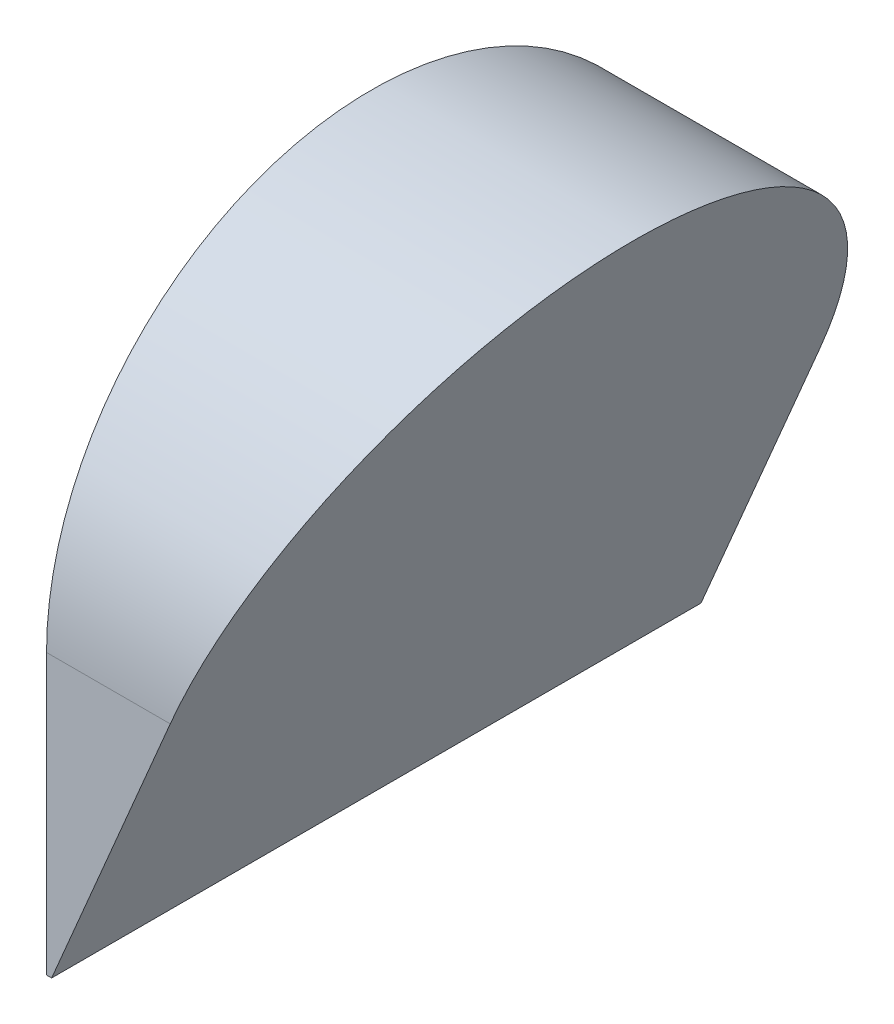
ISO-10303-21;
HEADER;
FILE_DESCRIPTION(('STEP AP214'),'2;1');
FILE_NAME('part.step','',(''),(''),'','','');
FILE_SCHEMA(('AUTOMOTIVE_DESIGN { 1 0 10303 214 1 1 1 1 }'));
ENDSEC;
DATA;
#1=APPLICATION_CONTEXT('core data for automotive mechanical design processes');
#2=APPLICATION_PROTOCOL_DEFINITION('international standard','automotive_design',2000,#1);
#3=PRODUCT_CONTEXT('',#1,'mechanical');
#4=PRODUCT('Part','Part','',(#3));
#5=PRODUCT_RELATED_PRODUCT_CATEGORY('part','',(#4));
#6=PRODUCT_DEFINITION_FORMATION('','',#4);
#7=PRODUCT_DEFINITION_CONTEXT('part definition',#1,'design');
#8=PRODUCT_DEFINITION('design','',#6,#7);
#9=PRODUCT_DEFINITION_SHAPE('','',#8);
#10=(LENGTH_UNIT() NAMED_UNIT(*) SI_UNIT(.MILLI.,.METRE.));
#11=(NAMED_UNIT(*) PLANE_ANGLE_UNIT() SI_UNIT($,.RADIAN.));
#12=(NAMED_UNIT(*) SI_UNIT($,.STERADIAN.) SOLID_ANGLE_UNIT());
#13=UNCERTAINTY_MEASURE_WITH_UNIT(LENGTH_MEASURE(1.E-05),#10,'distance_accuracy_value','');
#14=(GEOMETRIC_REPRESENTATION_CONTEXT(3) GLOBAL_UNCERTAINTY_ASSIGNED_CONTEXT((#13)) GLOBAL_UNIT_ASSIGNED_CONTEXT((#10,
#11,#12)) REPRESENTATION_CONTEXT('',''));
#15=CARTESIAN_POINT('',(0.,0.,0.));
#16=DIRECTION('',(0.,0.,1.));
#17=DIRECTION('',(1.,0.,0.));
#18=AXIS2_PLACEMENT_3D('',#15,#16,#17);
#19=CARTESIAN_POINT('',(934.933188751821,2501.84904611881,872.921418628591));
#20=DIRECTION('',(0.920504853452433,-0.390731128489291,0.));
#21=DIRECTION('',(-0.390731128489291,-0.920504853452433,0.));
#22=AXIS2_PLACEMENT_3D('',#19,#20,#21);
#23=PLANE('',#22);
#24=DIRECTION('',(0.,0.,1.));
#25=VECTOR('',#24,1.);
#26=CARTESIAN_POINT('',(169.394536040752,698.353,-205.));
#27=LINE('',#26,#25);
#28=CARTESIAN_POINT('',(169.394536040752,698.353,-205.));
#29=VERTEX_POINT('',#28);
#30=CARTESIAN_POINT('',(169.394536040752,698.353,225.));
#31=VERTEX_POINT('',#30);
#32=EDGE_CURVE('E32',#29,#31,#27,.T.);
#33=ORIENTED_EDGE('',*,*,#32,.F.);
#34=DIRECTION('',(-0.390731128489291,-0.920504853452433,0.));
#35=VECTOR('',#34,1.);
#36=CARTESIAN_POINT('',(347.246592808373,1117.3461887026,-205.));
#37=LINE('',#36,#35);
#38=CARTESIAN_POINT('',(247.922377039534,883.353,-205.));
#39=VERTEX_POINT('',#38);
#40=EDGE_CURVE('E11',#39,#29,#37,.T.);
#41=ORIENTED_EDGE('',*,*,#40,.F.);
#42=CARTESIAN_POINT('',(247.922377039534,883.353,9.99999999999987));
#43=DIRECTION('',(0.920504853452433,-0.390731128489291,0.));
#44=DIRECTION('',(-0.390731128489291,-0.920504853452433,0.));
#45=AXIS2_PLACEMENT_3D('',#42,#43,#44);
#46=ELLIPSE('',#45,233.56748114214,215.);
#47=CARTESIAN_POINT('',(247.922377039534,883.353,225.));
#48=VERTEX_POINT('',#47);
#49=EDGE_CURVE('E56',#48,#39,#46,.F.);
#50=ORIENTED_EDGE('',*,*,#49,.F.);
#51=DIRECTION('',(0.390731128489291,0.920504853452433,0.));
#52=VECTOR('',#51,1.);
#53=CARTESIAN_POINT('',(280.707661277045,960.590289435145,225.));
#54=LINE('',#53,#52);
#55=EDGE_CURVE('E65',#31,#48,#54,.T.);
#56=ORIENTED_EDGE('',*,*,#55,.F.);
#57=EDGE_LOOP('',(#33,#41,#50,#56));
#58=FACE_BOUND('',#57,.T.);
#59=ADVANCED_FACE('F17',(#58),#23,.T.);
#60=CARTESIAN_POINT('',(898.5,698.353,-205.));
#61=DIRECTION('',(0.,-1.,0.));
#62=DIRECTION('',(0.,0.,-1.));
#63=AXIS2_PLACEMENT_3D('',#60,#61,#62);
#64=PLANE('',#63);
#65=DIRECTION('',(-1.,0.,0.));
#66=VECTOR('',#65,1.);
#67=CARTESIAN_POINT('',(898.5,698.353,-205.));
#68=LINE('',#67,#66);
#69=CARTESIAN_POINT('',(166.000000000004,698.353,-205.));
#70=VERTEX_POINT('',#69);
#71=EDGE_CURVE('E38',#29,#70,#68,.T.);
#72=ORIENTED_EDGE('',*,*,#71,.F.);
#73=ORIENTED_EDGE('',*,*,#32,.T.);
#74=DIRECTION('',(-1.,0.,0.));
#75=VECTOR('',#74,1.);
#76=CARTESIAN_POINT('',(898.5,698.353,225.));
#77=LINE('',#76,#75);
#78=CARTESIAN_POINT('',(166.000000000003,698.353,225.));
#79=VERTEX_POINT('',#78);
#80=EDGE_CURVE('E25',#31,#79,#77,.T.);
#81=ORIENTED_EDGE('',*,*,#80,.T.);
#82=DIRECTION('',(0.,0.,1.));
#83=VECTOR('',#82,1.);
#84=CARTESIAN_POINT('',(166.000000000003,698.353,-205.));
#85=LINE('',#84,#83);
#86=EDGE_CURVE('E79',#70,#79,#85,.T.);
#87=ORIENTED_EDGE('',*,*,#86,.F.);
#88=EDGE_LOOP('',(#72,#73,#81,#87));
#89=FACE_BOUND('',#88,.T.);
#90=ADVANCED_FACE('F19',(#89),#64,.T.);
#91=CARTESIAN_POINT('',(898.5,698.353,225.));
#92=DIRECTION('',(0.,0.,1.));
#93=DIRECTION('',(0.,-1.,0.));
#94=AXIS2_PLACEMENT_3D('',#91,#92,#93);
#95=PLANE('',#94);
#96=ORIENTED_EDGE('',*,*,#80,.F.);
#97=ORIENTED_EDGE('',*,*,#55,.T.);
#98=DIRECTION('',(-1.,0.,0.));
#99=VECTOR('',#98,1.);
#100=CARTESIAN_POINT('',(898.5,883.353,225.));
#101=LINE('',#100,#99);
#102=CARTESIAN_POINT('',(166.000000000003,883.353,225.));
#103=VERTEX_POINT('',#102);
#104=EDGE_CURVE('E64',#48,#103,#101,.T.);
#105=ORIENTED_EDGE('',*,*,#104,.T.);
#106=DIRECTION('',(0.,1.,0.));
#107=VECTOR('',#106,1.);
#108=CARTESIAN_POINT('',(166.000000000003,698.353,225.));
#109=LINE('',#108,#107);
#110=EDGE_CURVE('E82',#79,#103,#109,.T.);
#111=ORIENTED_EDGE('',*,*,#110,.F.);
#112=EDGE_LOOP('',(#96,#97,#105,#111));
#113=FACE_BOUND('',#112,.T.);
#114=ADVANCED_FACE('F83',(#113),#95,.T.);
#115=CARTESIAN_POINT('',(898.5,883.353,10.0000000000002));
#116=DIRECTION('',(-1.,0.,0.));
#117=DIRECTION('',(0.,0.,1.));
#118=AXIS2_PLACEMENT_3D('',#115,#116,#117);
#119=CYLINDRICAL_SURFACE('',#118,215.);
#120=ORIENTED_EDGE('',*,*,#104,.F.);
#121=ORIENTED_EDGE('',*,*,#49,.T.);
#122=DIRECTION('',(-1.,0.,0.));
#123=VECTOR('',#122,1.);
#124=CARTESIAN_POINT('',(898.5,883.353,-205.));
#125=LINE('',#124,#123);
#126=CARTESIAN_POINT('',(166.000000000004,883.353,-205.));
#127=VERTEX_POINT('',#126);
#128=EDGE_CURVE('E63',#39,#127,#125,.T.);
#129=ORIENTED_EDGE('',*,*,#128,.T.);
#130=CARTESIAN_POINT('',(166.000000000003,883.353,9.99999999999984));
#131=DIRECTION('',(-1.,0.,0.));
#132=DIRECTION('',(0.,0.,1.));
#133=AXIS2_PLACEMENT_3D('',#130,#131,#132);
#134=CIRCLE('',#133,215.);
#135=EDGE_CURVE('E85',#103,#127,#134,.T.);
#136=ORIENTED_EDGE('',*,*,#135,.F.);
#137=EDGE_LOOP('',(#120,#121,#129,#136));
#138=FACE_BOUND('',#137,.T.);
#139=ADVANCED_FACE('F61',(#138),#119,.T.);
#140=CARTESIAN_POINT('',(898.5,883.353,-205.));
#141=DIRECTION('',(0.,0.,-1.));
#142=DIRECTION('',(0.,1.,0.));
#143=AXIS2_PLACEMENT_3D('',#140,#141,#142);
#144=PLANE('',#143);
#145=ORIENTED_EDGE('',*,*,#128,.F.);
#146=ORIENTED_EDGE('',*,*,#40,.T.);
#147=ORIENTED_EDGE('',*,*,#71,.T.);
#148=DIRECTION('',(0.,-1.,0.));
#149=VECTOR('',#148,1.);
#150=CARTESIAN_POINT('',(166.000000000004,883.353,-205.));
#151=LINE('',#150,#149);
#152=EDGE_CURVE('E68',#127,#70,#151,.T.);
#153=ORIENTED_EDGE('',*,*,#152,.F.);
#154=EDGE_LOOP('',(#145,#146,#147,#153));
#155=FACE_BOUND('',#154,.T.);
#156=ADVANCED_FACE('F67',(#155),#144,.T.);
#157=CARTESIAN_POINT('',(166.000000000003,883.353,9.99999999999984));
#158=DIRECTION('',(-1.,0.,0.));
#159=DIRECTION('',(0.,1.,0.));
#160=AXIS2_PLACEMENT_3D('',#157,#158,#159);
#161=PLANE('',#160);
#162=ORIENTED_EDGE('',*,*,#86,.T.);
#163=ORIENTED_EDGE('',*,*,#110,.T.);
#164=ORIENTED_EDGE('',*,*,#135,.T.);
#165=ORIENTED_EDGE('',*,*,#152,.T.);
#166=EDGE_LOOP('',(#162,#163,#164,#165));
#167=FACE_BOUND('',#166,.T.);
#168=ADVANCED_FACE('F87',(#167),#161,.T.);
#169=CLOSED_SHELL('',(#59,#90,#114,#139,#156,#168));
#170=MANIFOLD_SOLID_BREP('B1',#169);
#171=ADVANCED_BREP_SHAPE_REPRESENTATION('',(#18,#170),#14);
#172=SHAPE_DEFINITION_REPRESENTATION(#9,#171);
ENDSEC;
END-ISO-10303-21;
